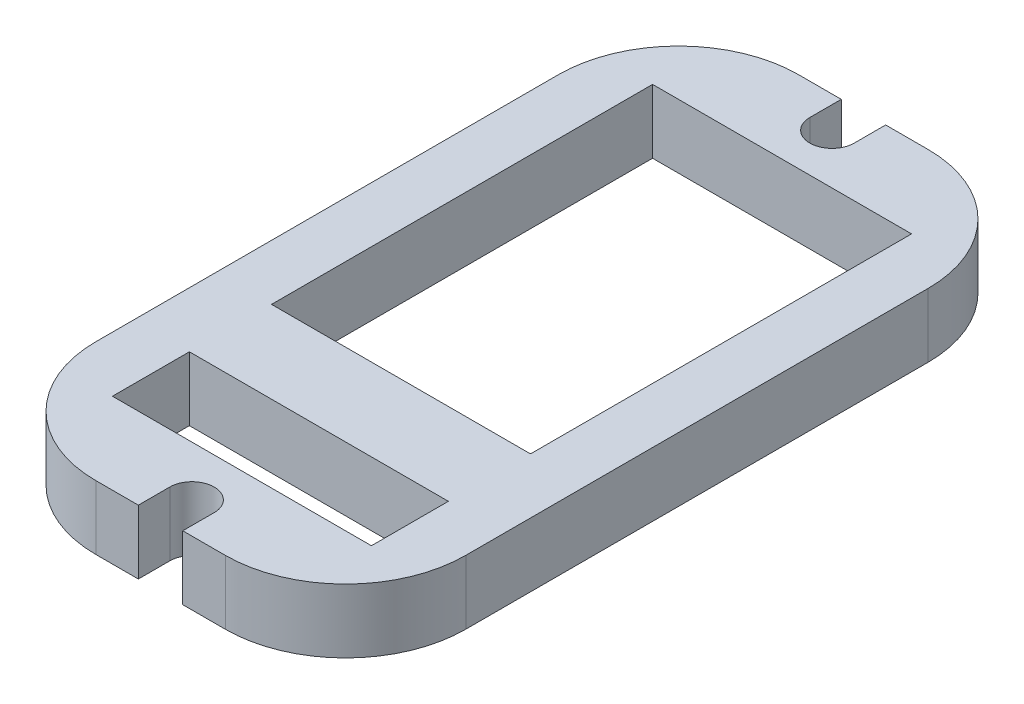
ISO-10303-21;
HEADER;
FILE_DESCRIPTION(('STEP AP214'),'2;1');
FILE_NAME('part.step','',(''),(''),'','','');
FILE_SCHEMA(('AUTOMOTIVE_DESIGN { 1 0 10303 214 1 1 1 1 }'));
ENDSEC;
DATA;
#1=APPLICATION_CONTEXT('core data for automotive mechanical design processes');
#2=APPLICATION_PROTOCOL_DEFINITION('international standard','automotive_design',2000,#1);
#3=PRODUCT_CONTEXT('',#1,'mechanical');
#4=PRODUCT('Part','Part','',(#3));
#5=PRODUCT_RELATED_PRODUCT_CATEGORY('part','',(#4));
#6=PRODUCT_DEFINITION_FORMATION('','',#4);
#7=PRODUCT_DEFINITION_CONTEXT('part definition',#1,'design');
#8=PRODUCT_DEFINITION('design','',#6,#7);
#9=PRODUCT_DEFINITION_SHAPE('','',#8);
#10=(LENGTH_UNIT() NAMED_UNIT(*) SI_UNIT(.MILLI.,.METRE.));
#11=(NAMED_UNIT(*) PLANE_ANGLE_UNIT() SI_UNIT($,.RADIAN.));
#12=(NAMED_UNIT(*) SI_UNIT($,.STERADIAN.) SOLID_ANGLE_UNIT());
#13=UNCERTAINTY_MEASURE_WITH_UNIT(LENGTH_MEASURE(1.E-05),#10,'distance_accuracy_value','');
#14=(GEOMETRIC_REPRESENTATION_CONTEXT(3) GLOBAL_UNCERTAINTY_ASSIGNED_CONTEXT((#13)) GLOBAL_UNIT_ASSIGNED_CONTEXT((#10,
#11,#12)) REPRESENTATION_CONTEXT('',''));
#15=CARTESIAN_POINT('',(0.,0.,0.));
#16=DIRECTION('',(0.,0.,1.));
#17=DIRECTION('',(1.,0.,0.));
#18=AXIS2_PLACEMENT_3D('',#15,#16,#17);
#19=CARTESIAN_POINT('',(0.,1.73,-8.65));
#20=DIRECTION('',(0.,1.,0.));
#21=DIRECTION('',(0.,0.,1.));
#22=AXIS2_PLACEMENT_3D('',#19,#20,#21);
#23=PLANE('',#22);
#24=CARTESIAN_POINT('',(0.,1.73,-8.65));
#25=DIRECTION('',(0.,-1.,0.));
#26=DIRECTION('',(0.,0.,1.));
#27=AXIS2_PLACEMENT_3D('',#24,#25,#26);
#28=CIRCLE('',#27,0.599999999999999);
#29=CARTESIAN_POINT('',(0.599999999999996,1.73,-8.65));
#30=VERTEX_POINT('',#29);
#31=CARTESIAN_POINT('',(-0.600000000000002,1.73,-8.65));
#32=VERTEX_POINT('',#31);
#33=EDGE_CURVE('E261',#30,#32,#28,.T.);
#34=ORIENTED_EDGE('',*,*,#33,.T.);
#35=DIRECTION('',(0.,0.,-1.));
#36=VECTOR('',#35,1.);
#37=CARTESIAN_POINT('',(-0.600000000000005,1.73,-9.5));
#38=LINE('',#37,#36);
#39=CARTESIAN_POINT('',(-0.600000000000005,1.73,-9.5));
#40=VERTEX_POINT('',#39);
#41=EDGE_CURVE('E264',#32,#40,#38,.T.);
#42=ORIENTED_EDGE('',*,*,#41,.T.);
#43=DIRECTION('',(-1.,0.,0.));
#44=VECTOR('',#43,1.);
#45=CARTESIAN_POINT('',(-0.600000000000005,1.73,-9.5));
#46=LINE('',#45,#44);
#47=CARTESIAN_POINT('',(-1.75000000000001,1.73,-9.5));
#48=VERTEX_POINT('',#47);
#49=EDGE_CURVE('E267',#40,#48,#46,.T.);
#50=ORIENTED_EDGE('',*,*,#49,.T.);
#51=CARTESIAN_POINT('',(-1.75000000000001,1.73,-6.25));
#52=DIRECTION('',(0.,1.,0.));
#53=DIRECTION('',(0.,0.,1.));
#54=AXIS2_PLACEMENT_3D('',#51,#52,#53);
#55=CIRCLE('',#54,3.25);
#56=CARTESIAN_POINT('',(-5.,1.73,-6.25));
#57=VERTEX_POINT('',#56);
#58=EDGE_CURVE('E269',#48,#57,#55,.T.);
#59=ORIENTED_EDGE('',*,*,#58,.T.);
#60=DIRECTION('',(0.,0.,1.));
#61=VECTOR('',#60,1.);
#62=CARTESIAN_POINT('',(-5.,1.73,-6.25));
#63=LINE('',#62,#61);
#64=CARTESIAN_POINT('',(-5.,1.73,6.25000000000001));
#65=VERTEX_POINT('',#64);
#66=EDGE_CURVE('E271',#57,#65,#63,.T.);
#67=ORIENTED_EDGE('',*,*,#66,.T.);
#68=CARTESIAN_POINT('',(-1.75000000000001,1.73,6.25000000000001));
#69=DIRECTION('',(0.,1.,0.));
#70=DIRECTION('',(0.,0.,1.));
#71=AXIS2_PLACEMENT_3D('',#68,#69,#70);
#72=CIRCLE('',#71,3.24999999999999);
#73=CARTESIAN_POINT('',(-1.75,1.73,9.5));
#74=VERTEX_POINT('',#73);
#75=EDGE_CURVE('E273',#65,#74,#72,.T.);
#76=ORIENTED_EDGE('',*,*,#75,.T.);
#77=DIRECTION('',(1.,0.,0.));
#78=VECTOR('',#77,1.);
#79=CARTESIAN_POINT('',(-1.75000000000001,1.73,9.5));
#80=LINE('',#79,#78);
#81=CARTESIAN_POINT('',(-0.600000000000005,1.73,9.5));
#82=VERTEX_POINT('',#81);
#83=EDGE_CURVE('E275',#74,#82,#80,.T.);
#84=ORIENTED_EDGE('',*,*,#83,.T.);
#85=DIRECTION('',(0.,0.,-1.));
#86=VECTOR('',#85,1.);
#87=CARTESIAN_POINT('',(-0.599999999999991,1.73,8.65));
#88=LINE('',#87,#86);
#89=CARTESIAN_POINT('',(-0.599999999999991,1.73,8.65));
#90=VERTEX_POINT('',#89);
#91=EDGE_CURVE('E277',#82,#90,#88,.T.);
#92=ORIENTED_EDGE('',*,*,#91,.T.);
#93=CARTESIAN_POINT('',(0.,1.73,8.65));
#94=DIRECTION('',(0.,-1.,0.));
#95=DIRECTION('',(0.,0.,1.));
#96=AXIS2_PLACEMENT_3D('',#93,#94,#95);
#97=CIRCLE('',#96,0.599999999999996);
#98=CARTESIAN_POINT('',(0.599999999999998,1.73,8.65));
#99=VERTEX_POINT('',#98);
#100=EDGE_CURVE('E279',#90,#99,#97,.T.);
#101=ORIENTED_EDGE('',*,*,#100,.T.);
#102=DIRECTION('',(0.,0.,1.));
#103=VECTOR('',#102,1.);
#104=CARTESIAN_POINT('',(0.600000000000001,1.73,8.65));
#105=LINE('',#104,#103);
#106=CARTESIAN_POINT('',(0.599999999999993,1.73,9.5));
#107=VERTEX_POINT('',#106);
#108=EDGE_CURVE('E281',#99,#107,#105,.T.);
#109=ORIENTED_EDGE('',*,*,#108,.T.);
#110=DIRECTION('',(1.,0.,0.));
#111=VECTOR('',#110,1.);
#112=CARTESIAN_POINT('',(0.599999999999993,1.73,9.5));
#113=LINE('',#112,#111);
#114=CARTESIAN_POINT('',(1.75,1.73,9.5));
#115=VERTEX_POINT('',#114);
#116=EDGE_CURVE('E283',#107,#115,#113,.T.);
#117=ORIENTED_EDGE('',*,*,#116,.T.);
#118=CARTESIAN_POINT('',(1.75000000000001,1.73,6.25));
#119=DIRECTION('',(0.,1.,0.));
#120=DIRECTION('',(0.,0.,1.));
#121=AXIS2_PLACEMENT_3D('',#118,#119,#120);
#122=CIRCLE('',#121,3.25);
#123=CARTESIAN_POINT('',(5.,1.73,6.25000000000001));
#124=VERTEX_POINT('',#123);
#125=EDGE_CURVE('E285',#115,#124,#122,.T.);
#126=ORIENTED_EDGE('',*,*,#125,.T.);
#127=DIRECTION('',(0.,0.,-1.));
#128=VECTOR('',#127,1.);
#129=CARTESIAN_POINT('',(5.,1.73,6.25000000000001));
#130=LINE('',#129,#128);
#131=CARTESIAN_POINT('',(5.,1.73,-6.25));
#132=VERTEX_POINT('',#131);
#133=EDGE_CURVE('E287',#124,#132,#130,.T.);
#134=ORIENTED_EDGE('',*,*,#133,.T.);
#135=CARTESIAN_POINT('',(1.75,1.73,-6.25));
#136=DIRECTION('',(0.,1.,0.));
#137=DIRECTION('',(0.,0.,1.));
#138=AXIS2_PLACEMENT_3D('',#135,#136,#137);
#139=CIRCLE('',#138,3.25);
#140=CARTESIAN_POINT('',(1.75,1.73,-9.5));
#141=VERTEX_POINT('',#140);
#142=EDGE_CURVE('E289',#132,#141,#139,.T.);
#143=ORIENTED_EDGE('',*,*,#142,.T.);
#144=DIRECTION('',(-1.,0.,0.));
#145=VECTOR('',#144,1.);
#146=CARTESIAN_POINT('',(1.75,1.73,-9.5));
#147=LINE('',#146,#145);
#148=CARTESIAN_POINT('',(0.599999999999993,1.73,-9.5));
#149=VERTEX_POINT('',#148);
#150=EDGE_CURVE('E291',#141,#149,#147,.T.);
#151=ORIENTED_EDGE('',*,*,#150,.T.);
#152=DIRECTION('',(0.,0.,1.));
#153=VECTOR('',#152,1.);
#154=CARTESIAN_POINT('',(0.599999999999993,1.73,-9.5));
#155=LINE('',#154,#153);
#156=EDGE_CURVE('E293',#149,#30,#155,.T.);
#157=ORIENTED_EDGE('',*,*,#156,.T.);
#158=EDGE_LOOP('',(#34,#42,#50,#59,#67,#76,#84,#92,#101,#109,#117,#126,#134,#143,#151,#157));
#159=FACE_BOUND('',#158,.T.);
#160=DIRECTION('',(1.,0.,0.));
#161=VECTOR('',#160,1.);
#162=CARTESIAN_POINT('',(-3.5,1.73,3.));
#163=LINE('',#162,#161);
#164=CARTESIAN_POINT('',(-3.5,1.73,3.));
#165=VERTEX_POINT('',#164);
#166=CARTESIAN_POINT('',(3.5,1.73,3.));
#167=VERTEX_POINT('',#166);
#168=EDGE_CURVE('E232',#165,#167,#163,.T.);
#169=ORIENTED_EDGE('',*,*,#168,.F.);
#170=DIRECTION('',(0.,0.,1.));
#171=VECTOR('',#170,1.);
#172=CARTESIAN_POINT('',(-3.5,1.73,-7.3));
#173=LINE('',#172,#171);
#174=CARTESIAN_POINT('',(-3.5,1.73,-7.3));
#175=VERTEX_POINT('',#174);
#176=EDGE_CURVE('E230',#175,#165,#173,.T.);
#177=ORIENTED_EDGE('',*,*,#176,.F.);
#178=DIRECTION('',(-1.,0.,0.));
#179=VECTOR('',#178,1.);
#180=CARTESIAN_POINT('',(3.5,1.73,-7.3));
#181=LINE('',#180,#179);
#182=CARTESIAN_POINT('',(3.5,1.73,-7.3));
#183=VERTEX_POINT('',#182);
#184=EDGE_CURVE('E238',#183,#175,#181,.T.);
#185=ORIENTED_EDGE('',*,*,#184,.F.);
#186=DIRECTION('',(0.,0.,-1.));
#187=VECTOR('',#186,1.);
#188=CARTESIAN_POINT('',(3.5,1.73,3.));
#189=LINE('',#188,#187);
#190=EDGE_CURVE('E235',#167,#183,#189,.T.);
#191=ORIENTED_EDGE('',*,*,#190,.F.);
#192=EDGE_LOOP('',(#169,#177,#185,#191));
#193=FACE_BOUND('',#192,.T.);
#194=DIRECTION('',(1.,0.,0.));
#195=VECTOR('',#194,1.);
#196=CARTESIAN_POINT('',(-3.5,1.73,7.3));
#197=LINE('',#196,#195);
#198=CARTESIAN_POINT('',(-3.5,1.73,7.3));
#199=VERTEX_POINT('',#198);
#200=CARTESIAN_POINT('',(3.5,1.73,7.3));
#201=VERTEX_POINT('',#200);
#202=EDGE_CURVE('E202',#199,#201,#197,.T.);
#203=ORIENTED_EDGE('',*,*,#202,.F.);
#204=DIRECTION('',(0.,0.,1.));
#205=VECTOR('',#204,1.);
#206=CARTESIAN_POINT('',(-3.5,1.73,5.22));
#207=LINE('',#206,#205);
#208=CARTESIAN_POINT('',(-3.5,1.73,5.22));
#209=VERTEX_POINT('',#208);
#210=EDGE_CURVE('E194',#209,#199,#207,.T.);
#211=ORIENTED_EDGE('',*,*,#210,.F.);
#212=DIRECTION('',(-1.,0.,0.));
#213=VECTOR('',#212,1.);
#214=CARTESIAN_POINT('',(3.5,1.73,5.22));
#215=LINE('',#214,#213);
#216=CARTESIAN_POINT('',(3.5,1.73,5.22));
#217=VERTEX_POINT('',#216);
#218=EDGE_CURVE('E216',#217,#209,#215,.T.);
#219=ORIENTED_EDGE('',*,*,#218,.F.);
#220=DIRECTION('',(0.,0.,-1.));
#221=VECTOR('',#220,1.);
#222=CARTESIAN_POINT('',(3.5,1.73,7.3));
#223=LINE('',#222,#221);
#224=EDGE_CURVE('E214',#201,#217,#223,.T.);
#225=ORIENTED_EDGE('',*,*,#224,.F.);
#226=EDGE_LOOP('',(#203,#211,#219,#225));
#227=FACE_BOUND('',#226,.T.);
#228=ADVANCED_FACE('F33',(#159,#193,#227),#23,.T.);
#229=CARTESIAN_POINT('',(0.,0.,-8.65));
#230=DIRECTION('',(0.,1.,0.));
#231=DIRECTION('',(0.,0.,1.));
#232=AXIS2_PLACEMENT_3D('',#229,#230,#231);
#233=PLANE('',#232);
#234=DIRECTION('',(0.,0.,1.));
#235=VECTOR('',#234,1.);
#236=CARTESIAN_POINT('',(-3.5,0.,-7.3));
#237=LINE('',#236,#235);
#238=CARTESIAN_POINT('',(-3.5,0.,-7.3));
#239=VERTEX_POINT('',#238);
#240=CARTESIAN_POINT('',(-3.5,0.,3.));
#241=VERTEX_POINT('',#240);
#242=EDGE_CURVE('E210',#239,#241,#237,.T.);
#243=ORIENTED_EDGE('',*,*,#242,.T.);
#244=DIRECTION('',(1.,0.,0.));
#245=VECTOR('',#244,1.);
#246=CARTESIAN_POINT('',(-3.5,0.,3.));
#247=LINE('',#246,#245);
#248=CARTESIAN_POINT('',(3.5,0.,3.));
#249=VERTEX_POINT('',#248);
#250=EDGE_CURVE('E243',#241,#249,#247,.T.);
#251=ORIENTED_EDGE('',*,*,#250,.T.);
#252=DIRECTION('',(0.,0.,-1.));
#253=VECTOR('',#252,1.);
#254=CARTESIAN_POINT('',(3.5,0.,3.));
#255=LINE('',#254,#253);
#256=CARTESIAN_POINT('',(3.5,0.,-7.3));
#257=VERTEX_POINT('',#256);
#258=EDGE_CURVE('E246',#249,#257,#255,.T.);
#259=ORIENTED_EDGE('',*,*,#258,.T.);
#260=DIRECTION('',(-1.,0.,0.));
#261=VECTOR('',#260,1.);
#262=CARTESIAN_POINT('',(3.5,0.,-7.3));
#263=LINE('',#262,#261);
#264=EDGE_CURVE('E233',#257,#239,#263,.T.);
#265=ORIENTED_EDGE('',*,*,#264,.T.);
#266=EDGE_LOOP('',(#243,#251,#259,#265));
#267=FACE_BOUND('',#266,.T.);
#268=CARTESIAN_POINT('',(0.,0.,-8.65));
#269=DIRECTION('',(0.,-1.,0.));
#270=DIRECTION('',(0.,0.,1.));
#271=AXIS2_PLACEMENT_3D('',#268,#269,#270);
#272=CIRCLE('',#271,0.599999999999999);
#273=CARTESIAN_POINT('',(0.599999999999996,0.,-8.65));
#274=VERTEX_POINT('',#273);
#275=CARTESIAN_POINT('',(-0.600000000000002,0.,-8.65));
#276=VERTEX_POINT('',#275);
#277=EDGE_CURVE('E260',#274,#276,#272,.T.);
#278=ORIENTED_EDGE('',*,*,#277,.F.);
#279=DIRECTION('',(0.,0.,1.));
#280=VECTOR('',#279,1.);
#281=CARTESIAN_POINT('',(0.599999999999993,0.,-9.5));
#282=LINE('',#281,#280);
#283=CARTESIAN_POINT('',(0.599999999999993,0.,-9.5));
#284=VERTEX_POINT('',#283);
#285=EDGE_CURVE('E265',#284,#274,#282,.T.);
#286=ORIENTED_EDGE('',*,*,#285,.F.);
#287=DIRECTION('',(-1.,0.,0.));
#288=VECTOR('',#287,1.);
#289=CARTESIAN_POINT('',(1.75,0.,-9.5));
#290=LINE('',#289,#288);
#291=CARTESIAN_POINT('',(1.75,0.,-9.5));
#292=VERTEX_POINT('',#291);
#293=EDGE_CURVE('E324',#292,#284,#290,.T.);
#294=ORIENTED_EDGE('',*,*,#293,.F.);
#295=CARTESIAN_POINT('',(1.75,0.,-6.25));
#296=DIRECTION('',(0.,1.,0.));
#297=DIRECTION('',(0.,0.,1.));
#298=AXIS2_PLACEMENT_3D('',#295,#296,#297);
#299=CIRCLE('',#298,3.25);
#300=CARTESIAN_POINT('',(5.,0.,-6.25));
#301=VERTEX_POINT('',#300);
#302=EDGE_CURVE('E322',#301,#292,#299,.T.);
#303=ORIENTED_EDGE('',*,*,#302,.F.);
#304=DIRECTION('',(0.,0.,-1.));
#305=VECTOR('',#304,1.);
#306=CARTESIAN_POINT('',(5.,0.,6.25000000000001));
#307=LINE('',#306,#305);
#308=CARTESIAN_POINT('',(5.,0.,6.25000000000001));
#309=VERTEX_POINT('',#308);
#310=EDGE_CURVE('E320',#309,#301,#307,.T.);
#311=ORIENTED_EDGE('',*,*,#310,.F.);
#312=CARTESIAN_POINT('',(1.75000000000001,0.,6.25));
#313=DIRECTION('',(0.,1.,0.));
#314=DIRECTION('',(0.,0.,1.));
#315=AXIS2_PLACEMENT_3D('',#312,#313,#314);
#316=CIRCLE('',#315,3.25);
#317=CARTESIAN_POINT('',(1.75,0.,9.5));
#318=VERTEX_POINT('',#317);
#319=EDGE_CURVE('E318',#318,#309,#316,.T.);
#320=ORIENTED_EDGE('',*,*,#319,.F.);
#321=DIRECTION('',(1.,0.,0.));
#322=VECTOR('',#321,1.);
#323=CARTESIAN_POINT('',(0.599999999999993,0.,9.5));
#324=LINE('',#323,#322);
#325=CARTESIAN_POINT('',(0.599999999999993,0.,9.5));
#326=VERTEX_POINT('',#325);
#327=EDGE_CURVE('E316',#326,#318,#324,.T.);
#328=ORIENTED_EDGE('',*,*,#327,.F.);
#329=DIRECTION('',(0.,0.,1.));
#330=VECTOR('',#329,1.);
#331=CARTESIAN_POINT('',(0.600000000000001,0.,8.65));
#332=LINE('',#331,#330);
#333=CARTESIAN_POINT('',(0.599999999999998,0.,8.65));
#334=VERTEX_POINT('',#333);
#335=EDGE_CURVE('E314',#334,#326,#332,.T.);
#336=ORIENTED_EDGE('',*,*,#335,.F.);
#337=CARTESIAN_POINT('',(0.,0.,8.65));
#338=DIRECTION('',(0.,-1.,0.));
#339=DIRECTION('',(0.,0.,1.));
#340=AXIS2_PLACEMENT_3D('',#337,#338,#339);
#341=CIRCLE('',#340,0.599999999999996);
#342=CARTESIAN_POINT('',(-0.599999999999991,0.,8.65));
#343=VERTEX_POINT('',#342);
#344=EDGE_CURVE('E312',#343,#334,#341,.T.);
#345=ORIENTED_EDGE('',*,*,#344,.F.);
#346=DIRECTION('',(0.,0.,-1.));
#347=VECTOR('',#346,1.);
#348=CARTESIAN_POINT('',(-0.599999999999991,0.,8.65));
#349=LINE('',#348,#347);
#350=CARTESIAN_POINT('',(-0.600000000000005,0.,9.5));
#351=VERTEX_POINT('',#350);
#352=EDGE_CURVE('E310',#351,#343,#349,.T.);
#353=ORIENTED_EDGE('',*,*,#352,.F.);
#354=DIRECTION('',(1.,0.,0.));
#355=VECTOR('',#354,1.);
#356=CARTESIAN_POINT('',(-1.75000000000001,0.,9.5));
#357=LINE('',#356,#355);
#358=CARTESIAN_POINT('',(-1.75,0.,9.5));
#359=VERTEX_POINT('',#358);
#360=EDGE_CURVE('E308',#359,#351,#357,.T.);
#361=ORIENTED_EDGE('',*,*,#360,.F.);
#362=CARTESIAN_POINT('',(-1.75000000000001,0.,6.25000000000001));
#363=DIRECTION('',(0.,1.,0.));
#364=DIRECTION('',(0.,0.,1.));
#365=AXIS2_PLACEMENT_3D('',#362,#363,#364);
#366=CIRCLE('',#365,3.24999999999999);
#367=CARTESIAN_POINT('',(-5.,0.,6.25000000000001));
#368=VERTEX_POINT('',#367);
#369=EDGE_CURVE('E306',#368,#359,#366,.T.);
#370=ORIENTED_EDGE('',*,*,#369,.F.);
#371=DIRECTION('',(0.,0.,1.));
#372=VECTOR('',#371,1.);
#373=CARTESIAN_POINT('',(-5.,0.,-6.25));
#374=LINE('',#373,#372);
#375=CARTESIAN_POINT('',(-5.,0.,-6.25));
#376=VERTEX_POINT('',#375);
#377=EDGE_CURVE('E304',#376,#368,#374,.T.);
#378=ORIENTED_EDGE('',*,*,#377,.F.);
#379=CARTESIAN_POINT('',(-1.75000000000001,0.,-6.25));
#380=DIRECTION('',(0.,1.,0.));
#381=DIRECTION('',(0.,0.,1.));
#382=AXIS2_PLACEMENT_3D('',#379,#380,#381);
#383=CIRCLE('',#382,3.25);
#384=CARTESIAN_POINT('',(-1.75000000000001,0.,-9.5));
#385=VERTEX_POINT('',#384);
#386=EDGE_CURVE('E302',#385,#376,#383,.T.);
#387=ORIENTED_EDGE('',*,*,#386,.F.);
#388=DIRECTION('',(-1.,0.,0.));
#389=VECTOR('',#388,1.);
#390=CARTESIAN_POINT('',(-0.600000000000005,0.,-9.5));
#391=LINE('',#390,#389);
#392=CARTESIAN_POINT('',(-0.600000000000005,0.,-9.5));
#393=VERTEX_POINT('',#392);
#394=EDGE_CURVE('E300',#393,#385,#391,.T.);
#395=ORIENTED_EDGE('',*,*,#394,.F.);
#396=DIRECTION('',(0.,0.,-1.));
#397=VECTOR('',#396,1.);
#398=CARTESIAN_POINT('',(-0.600000000000005,0.,-9.5));
#399=LINE('',#398,#397);
#400=EDGE_CURVE('E298',#276,#393,#399,.T.);
#401=ORIENTED_EDGE('',*,*,#400,.F.);
#402=EDGE_LOOP('',(#278,#286,#294,#303,#311,#320,#328,#336,#345,#353,#361,#370,#378,#387,#395,#401));
#403=FACE_BOUND('',#402,.T.);
#404=DIRECTION('',(0.,0.,1.));
#405=VECTOR('',#404,1.);
#406=CARTESIAN_POINT('',(-3.5,0.,5.22));
#407=LINE('',#406,#405);
#408=CARTESIAN_POINT('',(-3.5,0.,5.22));
#409=VERTEX_POINT('',#408);
#410=CARTESIAN_POINT('',(-3.5,0.,7.3));
#411=VERTEX_POINT('',#410);
#412=EDGE_CURVE('E56',#409,#411,#407,.T.);
#413=ORIENTED_EDGE('',*,*,#412,.T.);
#414=DIRECTION('',(1.,0.,0.));
#415=VECTOR('',#414,1.);
#416=CARTESIAN_POINT('',(-3.5,0.,7.3));
#417=LINE('',#416,#415);
#418=CARTESIAN_POINT('',(3.5,0.,7.3));
#419=VERTEX_POINT('',#418);
#420=EDGE_CURVE('E209',#411,#419,#417,.T.);
#421=ORIENTED_EDGE('',*,*,#420,.T.);
#422=DIRECTION('',(0.,0.,-1.));
#423=VECTOR('',#422,1.);
#424=CARTESIAN_POINT('',(3.5,0.,7.3));
#425=LINE('',#424,#423);
#426=CARTESIAN_POINT('',(3.5,0.,5.22));
#427=VERTEX_POINT('',#426);
#428=EDGE_CURVE('E222',#419,#427,#425,.T.);
#429=ORIENTED_EDGE('',*,*,#428,.T.);
#430=DIRECTION('',(-1.,0.,0.));
#431=VECTOR('',#430,1.);
#432=CARTESIAN_POINT('',(3.5,0.,5.22));
#433=LINE('',#432,#431);
#434=EDGE_CURVE('E203',#427,#409,#433,.T.);
#435=ORIENTED_EDGE('',*,*,#434,.T.);
#436=EDGE_LOOP('',(#413,#421,#429,#435));
#437=FACE_BOUND('',#436,.T.);
#438=ADVANCED_FACE('F378',(#267,#403,#437),#233,.F.);
#439=CARTESIAN_POINT('',(0.,1.73,-8.65));
#440=DIRECTION('',(0.,-1.,0.));
#441=DIRECTION('',(0.,0.,-1.));
#442=AXIS2_PLACEMENT_3D('',#439,#440,#441);
#443=CYLINDRICAL_SURFACE('',#442,0.599999999999999);
#444=ORIENTED_EDGE('',*,*,#277,.T.);
#445=DIRECTION('',(0.,-1.,0.));
#446=VECTOR('',#445,1.);
#447=CARTESIAN_POINT('',(-0.600000000000002,1.73,-8.65));
#448=LINE('',#447,#446);
#449=EDGE_CURVE('E11',#32,#276,#448,.T.);
#450=ORIENTED_EDGE('',*,*,#449,.F.);
#451=ORIENTED_EDGE('',*,*,#33,.F.);
#452=DIRECTION('',(0.,-1.,0.));
#453=VECTOR('',#452,1.);
#454=CARTESIAN_POINT('',(0.599999999999996,1.73,-8.65));
#455=LINE('',#454,#453);
#456=EDGE_CURVE('E295',#30,#274,#455,.T.);
#457=ORIENTED_EDGE('',*,*,#456,.T.);
#458=EDGE_LOOP('',(#444,#450,#451,#457));
#459=FACE_BOUND('',#458,.T.);
#460=ADVANCED_FACE('F35',(#459),#443,.F.);
#461=CARTESIAN_POINT('',(-0.600000000000005,1.73,-9.5));
#462=DIRECTION('',(-1.,0.,0.));
#463=DIRECTION('',(0.,0.,1.));
#464=AXIS2_PLACEMENT_3D('',#461,#462,#463);
#465=PLANE('',#464);
#466=ORIENTED_EDGE('',*,*,#400,.T.);
#467=DIRECTION('',(0.,-1.,0.));
#468=VECTOR('',#467,1.);
#469=CARTESIAN_POINT('',(-0.600000000000005,1.73,-9.5));
#470=LINE('',#469,#468);
#471=EDGE_CURVE('E41',#40,#393,#470,.T.);
#472=ORIENTED_EDGE('',*,*,#471,.F.);
#473=ORIENTED_EDGE('',*,*,#41,.F.);
#474=ORIENTED_EDGE('',*,*,#449,.T.);
#475=EDGE_LOOP('',(#466,#472,#473,#474));
#476=FACE_BOUND('',#475,.T.);
#477=ADVANCED_FACE('F396',(#476),#465,.F.);
#478=CARTESIAN_POINT('',(-0.600000000000005,1.73,-9.5));
#479=DIRECTION('',(0.,0.,1.));
#480=DIRECTION('',(1.,0.,0.));
#481=AXIS2_PLACEMENT_3D('',#478,#479,#480);
#482=PLANE('',#481);
#483=ORIENTED_EDGE('',*,*,#394,.T.);
#484=DIRECTION('',(0.,-1.,0.));
#485=VECTOR('',#484,1.);
#486=CARTESIAN_POINT('',(-1.75000000000001,1.73,-9.5));
#487=LINE('',#486,#485);
#488=EDGE_CURVE('E365',#48,#385,#487,.T.);
#489=ORIENTED_EDGE('',*,*,#488,.F.);
#490=ORIENTED_EDGE('',*,*,#49,.F.);
#491=ORIENTED_EDGE('',*,*,#471,.T.);
#492=EDGE_LOOP('',(#483,#489,#490,#491));
#493=FACE_BOUND('',#492,.T.);
#494=ADVANCED_FACE('F372',(#493),#482,.F.);
#495=CARTESIAN_POINT('',(-1.75000000000001,1.73,-6.25));
#496=DIRECTION('',(0.,-1.,0.));
#497=DIRECTION('',(0.,0.,-1.));
#498=AXIS2_PLACEMENT_3D('',#495,#496,#497);
#499=CYLINDRICAL_SURFACE('',#498,3.25);
#500=ORIENTED_EDGE('',*,*,#386,.T.);
#501=DIRECTION('',(0.,-1.,0.));
#502=VECTOR('',#501,1.);
#503=CARTESIAN_POINT('',(-5.,1.73,-6.25));
#504=LINE('',#503,#502);
#505=EDGE_CURVE('E362',#57,#376,#504,.T.);
#506=ORIENTED_EDGE('',*,*,#505,.F.);
#507=ORIENTED_EDGE('',*,*,#58,.F.);
#508=ORIENTED_EDGE('',*,*,#488,.T.);
#509=EDGE_LOOP('',(#500,#506,#507,#508));
#510=FACE_BOUND('',#509,.T.);
#511=ADVANCED_FACE('F384',(#510),#499,.T.);
#512=CARTESIAN_POINT('',(-5.,1.73,-6.25));
#513=DIRECTION('',(1.,0.,0.));
#514=DIRECTION('',(0.,0.,-1.));
#515=AXIS2_PLACEMENT_3D('',#512,#513,#514);
#516=PLANE('',#515);
#517=ORIENTED_EDGE('',*,*,#377,.T.);
#518=DIRECTION('',(0.,-1.,0.));
#519=VECTOR('',#518,1.);
#520=CARTESIAN_POINT('',(-5.,1.73,6.25000000000001));
#521=LINE('',#520,#519);
#522=EDGE_CURVE('E359',#65,#368,#521,.T.);
#523=ORIENTED_EDGE('',*,*,#522,.F.);
#524=ORIENTED_EDGE('',*,*,#66,.F.);
#525=ORIENTED_EDGE('',*,*,#505,.T.);
#526=EDGE_LOOP('',(#517,#523,#524,#525));
#527=FACE_BOUND('',#526,.T.);
#528=ADVANCED_FACE('F388',(#527),#516,.F.);
#529=CARTESIAN_POINT('',(-1.75000000000001,1.73,6.25000000000001));
#530=DIRECTION('',(0.,-1.,0.));
#531=DIRECTION('',(0.,0.,-1.));
#532=AXIS2_PLACEMENT_3D('',#529,#530,#531);
#533=CYLINDRICAL_SURFACE('',#532,3.24999999999999);
#534=ORIENTED_EDGE('',*,*,#369,.T.);
#535=DIRECTION('',(0.,-1.,0.));
#536=VECTOR('',#535,1.);
#537=CARTESIAN_POINT('',(-1.75,1.73,9.5));
#538=LINE('',#537,#536);
#539=EDGE_CURVE('E356',#74,#359,#538,.T.);
#540=ORIENTED_EDGE('',*,*,#539,.F.);
#541=ORIENTED_EDGE('',*,*,#75,.F.);
#542=ORIENTED_EDGE('',*,*,#522,.T.);
#543=EDGE_LOOP('',(#534,#540,#541,#542));
#544=FACE_BOUND('',#543,.T.);
#545=ADVANCED_FACE('F449',(#544),#533,.T.);
#546=CARTESIAN_POINT('',(-1.75000000000001,1.73,9.5));
#547=DIRECTION('',(0.,0.,-1.));
#548=DIRECTION('',(-1.,0.,0.));
#549=AXIS2_PLACEMENT_3D('',#546,#547,#548);
#550=PLANE('',#549);
#551=ORIENTED_EDGE('',*,*,#360,.T.);
#552=DIRECTION('',(0.,-1.,0.));
#553=VECTOR('',#552,1.);
#554=CARTESIAN_POINT('',(-0.600000000000005,1.73,9.5));
#555=LINE('',#554,#553);
#556=EDGE_CURVE('E353',#82,#351,#555,.T.);
#557=ORIENTED_EDGE('',*,*,#556,.F.);
#558=ORIENTED_EDGE('',*,*,#83,.F.);
#559=ORIENTED_EDGE('',*,*,#539,.T.);
#560=EDGE_LOOP('',(#551,#557,#558,#559));
#561=FACE_BOUND('',#560,.T.);
#562=ADVANCED_FACE('F446',(#561),#550,.F.);
#563=CARTESIAN_POINT('',(-0.599999999999991,1.73,8.65));
#564=DIRECTION('',(-1.,0.,0.));
#565=DIRECTION('',(0.,0.,1.));
#566=AXIS2_PLACEMENT_3D('',#563,#564,#565);
#567=PLANE('',#566);
#568=ORIENTED_EDGE('',*,*,#352,.T.);
#569=DIRECTION('',(0.,-1.,0.));
#570=VECTOR('',#569,1.);
#571=CARTESIAN_POINT('',(-0.599999999999991,1.73,8.65));
#572=LINE('',#571,#570);
#573=EDGE_CURVE('E350',#90,#343,#572,.T.);
#574=ORIENTED_EDGE('',*,*,#573,.F.);
#575=ORIENTED_EDGE('',*,*,#91,.F.);
#576=ORIENTED_EDGE('',*,*,#556,.T.);
#577=EDGE_LOOP('',(#568,#574,#575,#576));
#578=FACE_BOUND('',#577,.T.);
#579=ADVANCED_FACE('F442',(#578),#567,.F.);
#580=CARTESIAN_POINT('',(0.,1.73,8.65));
#581=DIRECTION('',(0.,-1.,0.));
#582=DIRECTION('',(0.,0.,-1.));
#583=AXIS2_PLACEMENT_3D('',#580,#581,#582);
#584=CYLINDRICAL_SURFACE('',#583,0.599999999999996);
#585=ORIENTED_EDGE('',*,*,#344,.T.);
#586=DIRECTION('',(0.,-1.,0.));
#587=VECTOR('',#586,1.);
#588=CARTESIAN_POINT('',(0.599999999999998,1.73,8.65));
#589=LINE('',#588,#587);
#590=EDGE_CURVE('E347',#99,#334,#589,.T.);
#591=ORIENTED_EDGE('',*,*,#590,.F.);
#592=ORIENTED_EDGE('',*,*,#100,.F.);
#593=ORIENTED_EDGE('',*,*,#573,.T.);
#594=EDGE_LOOP('',(#585,#591,#592,#593));
#595=FACE_BOUND('',#594,.T.);
#596=ADVANCED_FACE('F438',(#595),#584,.F.);
#597=CARTESIAN_POINT('',(0.600000000000001,1.73,8.65));
#598=DIRECTION('',(1.,0.,0.));
#599=DIRECTION('',(0.,0.,-1.));
#600=AXIS2_PLACEMENT_3D('',#597,#598,#599);
#601=PLANE('',#600);
#602=ORIENTED_EDGE('',*,*,#335,.T.);
#603=DIRECTION('',(0.,-1.,0.));
#604=VECTOR('',#603,1.);
#605=CARTESIAN_POINT('',(0.599999999999993,1.73,9.5));
#606=LINE('',#605,#604);
#607=EDGE_CURVE('E344',#107,#326,#606,.T.);
#608=ORIENTED_EDGE('',*,*,#607,.F.);
#609=ORIENTED_EDGE('',*,*,#108,.F.);
#610=ORIENTED_EDGE('',*,*,#590,.T.);
#611=EDGE_LOOP('',(#602,#608,#609,#610));
#612=FACE_BOUND('',#611,.T.);
#613=ADVANCED_FACE('F433',(#612),#601,.F.);
#614=CARTESIAN_POINT('',(0.599999999999993,1.73,9.5));
#615=DIRECTION('',(0.,0.,-1.));
#616=DIRECTION('',(-1.,0.,0.));
#617=AXIS2_PLACEMENT_3D('',#614,#615,#616);
#618=PLANE('',#617);
#619=ORIENTED_EDGE('',*,*,#327,.T.);
#620=DIRECTION('',(0.,-1.,0.));
#621=VECTOR('',#620,1.);
#622=CARTESIAN_POINT('',(1.75,1.73,9.5));
#623=LINE('',#622,#621);
#624=EDGE_CURVE('E341',#115,#318,#623,.T.);
#625=ORIENTED_EDGE('',*,*,#624,.F.);
#626=ORIENTED_EDGE('',*,*,#116,.F.);
#627=ORIENTED_EDGE('',*,*,#607,.T.);
#628=EDGE_LOOP('',(#619,#625,#626,#627));
#629=FACE_BOUND('',#628,.T.);
#630=ADVANCED_FACE('F427',(#629),#618,.F.);
#631=CARTESIAN_POINT('',(1.75000000000001,1.73,6.25));
#632=DIRECTION('',(0.,-1.,0.));
#633=DIRECTION('',(0.,0.,-1.));
#634=AXIS2_PLACEMENT_3D('',#631,#632,#633);
#635=CYLINDRICAL_SURFACE('',#634,3.25);
#636=ORIENTED_EDGE('',*,*,#319,.T.);
#637=DIRECTION('',(0.,-1.,0.));
#638=VECTOR('',#637,1.);
#639=CARTESIAN_POINT('',(5.,1.73,6.25000000000001));
#640=LINE('',#639,#638);
#641=EDGE_CURVE('E338',#124,#309,#640,.T.);
#642=ORIENTED_EDGE('',*,*,#641,.F.);
#643=ORIENTED_EDGE('',*,*,#125,.F.);
#644=ORIENTED_EDGE('',*,*,#624,.T.);
#645=EDGE_LOOP('',(#636,#642,#643,#644));
#646=FACE_BOUND('',#645,.T.);
#647=ADVANCED_FACE('F423',(#646),#635,.T.);
#648=CARTESIAN_POINT('',(5.,1.73,6.25000000000001));
#649=DIRECTION('',(-1.,0.,0.));
#650=DIRECTION('',(0.,0.,1.));
#651=AXIS2_PLACEMENT_3D('',#648,#649,#650);
#652=PLANE('',#651);
#653=ORIENTED_EDGE('',*,*,#310,.T.);
#654=DIRECTION('',(0.,-1.,0.));
#655=VECTOR('',#654,1.);
#656=CARTESIAN_POINT('',(5.,1.73,-6.25));
#657=LINE('',#656,#655);
#658=EDGE_CURVE('E335',#132,#301,#657,.T.);
#659=ORIENTED_EDGE('',*,*,#658,.F.);
#660=ORIENTED_EDGE('',*,*,#133,.F.);
#661=ORIENTED_EDGE('',*,*,#641,.T.);
#662=EDGE_LOOP('',(#653,#659,#660,#661));
#663=FACE_BOUND('',#662,.T.);
#664=ADVANCED_FACE('F418',(#663),#652,.F.);
#665=CARTESIAN_POINT('',(1.75,1.73,-6.25));
#666=DIRECTION('',(0.,-1.,0.));
#667=DIRECTION('',(0.,0.,-1.));
#668=AXIS2_PLACEMENT_3D('',#665,#666,#667);
#669=CYLINDRICAL_SURFACE('',#668,3.25);
#670=ORIENTED_EDGE('',*,*,#302,.T.);
#671=DIRECTION('',(0.,-1.,0.));
#672=VECTOR('',#671,1.);
#673=CARTESIAN_POINT('',(1.75,1.73,-9.5));
#674=LINE('',#673,#672);
#675=EDGE_CURVE('E332',#141,#292,#674,.T.);
#676=ORIENTED_EDGE('',*,*,#675,.F.);
#677=ORIENTED_EDGE('',*,*,#142,.F.);
#678=ORIENTED_EDGE('',*,*,#658,.T.);
#679=EDGE_LOOP('',(#670,#676,#677,#678));
#680=FACE_BOUND('',#679,.T.);
#681=ADVANCED_FACE('F412',(#680),#669,.T.);
#682=CARTESIAN_POINT('',(1.75,1.73,-9.5));
#683=DIRECTION('',(0.,0.,1.));
#684=DIRECTION('',(1.,0.,0.));
#685=AXIS2_PLACEMENT_3D('',#682,#683,#684);
#686=PLANE('',#685);
#687=ORIENTED_EDGE('',*,*,#293,.T.);
#688=DIRECTION('',(0.,-1.,0.));
#689=VECTOR('',#688,1.);
#690=CARTESIAN_POINT('',(0.599999999999993,1.73,-9.5));
#691=LINE('',#690,#689);
#692=EDGE_CURVE('E329',#149,#284,#691,.T.);
#693=ORIENTED_EDGE('',*,*,#692,.F.);
#694=ORIENTED_EDGE('',*,*,#150,.F.);
#695=ORIENTED_EDGE('',*,*,#675,.T.);
#696=EDGE_LOOP('',(#687,#693,#694,#695));
#697=FACE_BOUND('',#696,.T.);
#698=ADVANCED_FACE('F408',(#697),#686,.F.);
#699=CARTESIAN_POINT('',(0.599999999999993,1.73,-9.5));
#700=DIRECTION('',(1.,0.,0.));
#701=DIRECTION('',(0.,0.,-1.));
#702=AXIS2_PLACEMENT_3D('',#699,#700,#701);
#703=PLANE('',#702);
#704=ORIENTED_EDGE('',*,*,#285,.T.);
#705=ORIENTED_EDGE('',*,*,#456,.F.);
#706=ORIENTED_EDGE('',*,*,#156,.F.);
#707=ORIENTED_EDGE('',*,*,#692,.T.);
#708=EDGE_LOOP('',(#704,#705,#706,#707));
#709=FACE_BOUND('',#708,.T.);
#710=ADVANCED_FACE('F403',(#709),#703,.F.);
#711=CARTESIAN_POINT('',(-3.5,1.73,-7.3));
#712=DIRECTION('',(1.,0.,0.));
#713=DIRECTION('',(0.,0.,-1.));
#714=AXIS2_PLACEMENT_3D('',#711,#712,#713);
#715=PLANE('',#714);
#716=ORIENTED_EDGE('',*,*,#242,.F.);
#717=DIRECTION('',(0.,-1.,0.));
#718=VECTOR('',#717,1.);
#719=CARTESIAN_POINT('',(-3.5,1.73,-7.3));
#720=LINE('',#719,#718);
#721=EDGE_CURVE('E240',#175,#239,#720,.T.);
#722=ORIENTED_EDGE('',*,*,#721,.F.);
#723=ORIENTED_EDGE('',*,*,#176,.T.);
#724=DIRECTION('',(0.,-1.,0.));
#725=VECTOR('',#724,1.);
#726=CARTESIAN_POINT('',(-3.5,1.73,3.));
#727=LINE('',#726,#725);
#728=EDGE_CURVE('E257',#165,#241,#727,.T.);
#729=ORIENTED_EDGE('',*,*,#728,.T.);
#730=EDGE_LOOP('',(#716,#722,#723,#729));
#731=FACE_BOUND('',#730,.T.);
#732=ADVANCED_FACE('F466',(#731),#715,.T.);
#733=CARTESIAN_POINT('',(-3.5,1.73,3.));
#734=DIRECTION('',(0.,0.,-1.));
#735=DIRECTION('',(-1.,0.,0.));
#736=AXIS2_PLACEMENT_3D('',#733,#734,#735);
#737=PLANE('',#736);
#738=ORIENTED_EDGE('',*,*,#250,.F.);
#739=ORIENTED_EDGE('',*,*,#728,.F.);
#740=ORIENTED_EDGE('',*,*,#168,.T.);
#741=DIRECTION('',(0.,-1.,0.));
#742=VECTOR('',#741,1.);
#743=CARTESIAN_POINT('',(3.5,1.73,3.));
#744=LINE('',#743,#742);
#745=EDGE_CURVE('E255',#167,#249,#744,.T.);
#746=ORIENTED_EDGE('',*,*,#745,.T.);
#747=EDGE_LOOP('',(#738,#739,#740,#746));
#748=FACE_BOUND('',#747,.T.);
#749=ADVANCED_FACE('F528',(#748),#737,.T.);
#750=CARTESIAN_POINT('',(3.5,1.73,3.));
#751=DIRECTION('',(-1.,0.,0.));
#752=DIRECTION('',(0.,0.,1.));
#753=AXIS2_PLACEMENT_3D('',#750,#751,#752);
#754=PLANE('',#753);
#755=ORIENTED_EDGE('',*,*,#258,.F.);
#756=ORIENTED_EDGE('',*,*,#745,.F.);
#757=ORIENTED_EDGE('',*,*,#190,.T.);
#758=DIRECTION('',(0.,-1.,0.));
#759=VECTOR('',#758,1.);
#760=CARTESIAN_POINT('',(3.5,1.73,-7.3));
#761=LINE('',#760,#759);
#762=EDGE_CURVE('E253',#183,#257,#761,.T.);
#763=ORIENTED_EDGE('',*,*,#762,.T.);
#764=EDGE_LOOP('',(#755,#756,#757,#763));
#765=FACE_BOUND('',#764,.T.);
#766=ADVANCED_FACE('F535',(#765),#754,.T.);
#767=CARTESIAN_POINT('',(3.5,1.73,-7.3));
#768=DIRECTION('',(0.,0.,1.));
#769=DIRECTION('',(1.,0.,0.));
#770=AXIS2_PLACEMENT_3D('',#767,#768,#769);
#771=PLANE('',#770);
#772=ORIENTED_EDGE('',*,*,#264,.F.);
#773=ORIENTED_EDGE('',*,*,#762,.F.);
#774=ORIENTED_EDGE('',*,*,#184,.T.);
#775=ORIENTED_EDGE('',*,*,#721,.T.);
#776=EDGE_LOOP('',(#772,#773,#774,#775));
#777=FACE_BOUND('',#776,.T.);
#778=ADVANCED_FACE('F542',(#777),#771,.T.);
#779=CARTESIAN_POINT('',(-3.5,1.73,5.22));
#780=DIRECTION('',(1.,0.,0.));
#781=DIRECTION('',(0.,0.,-1.));
#782=AXIS2_PLACEMENT_3D('',#779,#780,#781);
#783=PLANE('',#782);
#784=ORIENTED_EDGE('',*,*,#412,.F.);
#785=DIRECTION('',(0.,-1.,0.));
#786=VECTOR('',#785,1.);
#787=CARTESIAN_POINT('',(-3.5,1.73,5.22));
#788=LINE('',#787,#786);
#789=EDGE_CURVE('E198',#209,#409,#788,.T.);
#790=ORIENTED_EDGE('',*,*,#789,.F.);
#791=ORIENTED_EDGE('',*,*,#210,.T.);
#792=DIRECTION('',(0.,-1.,0.));
#793=VECTOR('',#792,1.);
#794=CARTESIAN_POINT('',(-3.5,1.73,7.3));
#795=LINE('',#794,#793);
#796=EDGE_CURVE('E197',#199,#411,#795,.T.);
#797=ORIENTED_EDGE('',*,*,#796,.T.);
#798=EDGE_LOOP('',(#784,#790,#791,#797));
#799=FACE_BOUND('',#798,.T.);
#800=ADVANCED_FACE('F196',(#799),#783,.T.);
#801=CARTESIAN_POINT('',(-3.5,1.73,7.3));
#802=DIRECTION('',(0.,0.,-1.));
#803=DIRECTION('',(-1.,0.,0.));
#804=AXIS2_PLACEMENT_3D('',#801,#802,#803);
#805=PLANE('',#804);
#806=ORIENTED_EDGE('',*,*,#420,.F.);
#807=ORIENTED_EDGE('',*,*,#796,.F.);
#808=ORIENTED_EDGE('',*,*,#202,.T.);
#809=DIRECTION('',(0.,-1.,0.));
#810=VECTOR('',#809,1.);
#811=CARTESIAN_POINT('',(3.5,1.73,7.3));
#812=LINE('',#811,#810);
#813=EDGE_CURVE('E211',#201,#419,#812,.T.);
#814=ORIENTED_EDGE('',*,*,#813,.T.);
#815=EDGE_LOOP('',(#806,#807,#808,#814));
#816=FACE_BOUND('',#815,.T.);
#817=ADVANCED_FACE('F206',(#816),#805,.T.);
#818=CARTESIAN_POINT('',(3.5,1.73,7.3));
#819=DIRECTION('',(-1.,0.,0.));
#820=DIRECTION('',(0.,0.,1.));
#821=AXIS2_PLACEMENT_3D('',#818,#819,#820);
#822=PLANE('',#821);
#823=ORIENTED_EDGE('',*,*,#428,.F.);
#824=ORIENTED_EDGE('',*,*,#813,.F.);
#825=ORIENTED_EDGE('',*,*,#224,.T.);
#826=DIRECTION('',(0.,-1.,0.));
#827=VECTOR('',#826,1.);
#828=CARTESIAN_POINT('',(3.5,1.73,5.22));
#829=LINE('',#828,#827);
#830=EDGE_CURVE('E48',#217,#427,#829,.T.);
#831=ORIENTED_EDGE('',*,*,#830,.T.);
#832=EDGE_LOOP('',(#823,#824,#825,#831));
#833=FACE_BOUND('',#832,.T.);
#834=ADVANCED_FACE('F563',(#833),#822,.T.);
#835=CARTESIAN_POINT('',(3.5,1.73,5.22));
#836=DIRECTION('',(0.,0.,1.));
#837=DIRECTION('',(1.,0.,0.));
#838=AXIS2_PLACEMENT_3D('',#835,#836,#837);
#839=PLANE('',#838);
#840=ORIENTED_EDGE('',*,*,#434,.F.);
#841=ORIENTED_EDGE('',*,*,#830,.F.);
#842=ORIENTED_EDGE('',*,*,#218,.T.);
#843=ORIENTED_EDGE('',*,*,#789,.T.);
#844=EDGE_LOOP('',(#840,#841,#842,#843));
#845=FACE_BOUND('',#844,.T.);
#846=ADVANCED_FACE('F570',(#845),#839,.T.);
#847=CLOSED_SHELL('',(#228,#438,#460,#477,#494,#511,#528,#545,#562,#579,#596,#613,#630,#647,
#664,#681,#698,#710,#732,#749,#766,#778,#800,#817,#834,#846));
#848=MANIFOLD_SOLID_BREP('B2',#847);
#849=ADVANCED_BREP_SHAPE_REPRESENTATION('',(#18,#848),#14);
#850=SHAPE_DEFINITION_REPRESENTATION(#9,#849);
ENDSEC;
END-ISO-10303-21;
